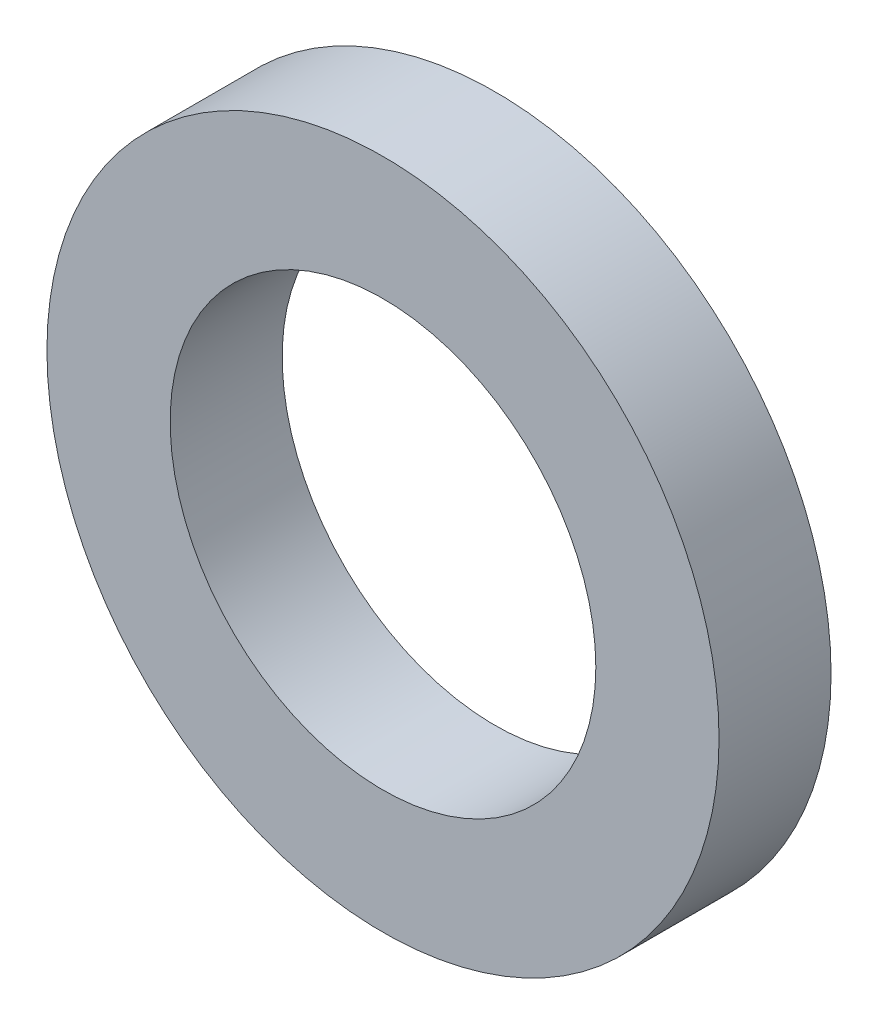
ISO-10303-21;
HEADER;
FILE_DESCRIPTION(('STEP AP214'),'2;1');
FILE_NAME('part.step','',(''),(''),'','','');
FILE_SCHEMA(('AUTOMOTIVE_DESIGN { 1 0 10303 214 1 1 1 1 }'));
ENDSEC;
DATA;
#1=APPLICATION_CONTEXT('core data for automotive mechanical design processes');
#2=APPLICATION_PROTOCOL_DEFINITION('international standard','automotive_design',2000,#1);
#3=PRODUCT_CONTEXT('',#1,'mechanical');
#4=PRODUCT('Part','Part','',(#3));
#5=PRODUCT_RELATED_PRODUCT_CATEGORY('part','',(#4));
#6=PRODUCT_DEFINITION_FORMATION('','',#4);
#7=PRODUCT_DEFINITION_CONTEXT('part definition',#1,'design');
#8=PRODUCT_DEFINITION('design','',#6,#7);
#9=PRODUCT_DEFINITION_SHAPE('','',#8);
#10=(LENGTH_UNIT() NAMED_UNIT(*) SI_UNIT(.MILLI.,.METRE.));
#11=(NAMED_UNIT(*) PLANE_ANGLE_UNIT() SI_UNIT($,.RADIAN.));
#12=(NAMED_UNIT(*) SI_UNIT($,.STERADIAN.) SOLID_ANGLE_UNIT());
#13=UNCERTAINTY_MEASURE_WITH_UNIT(LENGTH_MEASURE(1.E-05),#10,'distance_accuracy_value','');
#14=(GEOMETRIC_REPRESENTATION_CONTEXT(3) GLOBAL_UNCERTAINTY_ASSIGNED_CONTEXT((#13)) GLOBAL_UNIT_ASSIGNED_CONTEXT((#10,
#11,#12)) REPRESENTATION_CONTEXT('',''));
#15=CARTESIAN_POINT('',(0.,0.,0.));
#16=DIRECTION('',(0.,0.,1.));
#17=DIRECTION('',(1.,0.,0.));
#18=AXIS2_PLACEMENT_3D('',#15,#16,#17);
#19=CARTESIAN_POINT('',(0.,0.,1.));
#20=DIRECTION('',(0.,0.,1.));
#21=DIRECTION('',(1.,0.,0.));
#22=AXIS2_PLACEMENT_3D('',#19,#20,#21);
#23=PLANE('',#22);
#24=CARTESIAN_POINT('',(0.,0.,1.));
#25=DIRECTION('',(0.,0.,1.));
#26=DIRECTION('',(1.,0.,0.));
#27=AXIS2_PLACEMENT_3D('',#24,#25,#26);
#28=CIRCLE('',#27,3.);
#29=CARTESIAN_POINT('',(3.,0.,1.));
#30=VERTEX_POINT('',#29);
#31=EDGE_CURVE('E10',#30,#30,#28,.T.);
#32=ORIENTED_EDGE('',*,*,#31,.T.);
#33=EDGE_LOOP('',(#32));
#34=FACE_BOUND('',#33,.T.);
#35=CARTESIAN_POINT('',(0.,0.,1.));
#36=DIRECTION('',(0.,0.,1.));
#37=DIRECTION('',(1.,0.,0.));
#38=AXIS2_PLACEMENT_3D('',#35,#36,#37);
#39=CIRCLE('',#38,1.9);
#40=CARTESIAN_POINT('',(1.9,0.,1.));
#41=VERTEX_POINT('',#40);
#42=EDGE_CURVE('E50',#41,#41,#39,.T.);
#43=ORIENTED_EDGE('',*,*,#42,.F.);
#44=EDGE_LOOP('',(#43));
#45=FACE_BOUND('',#44,.T.);
#46=ADVANCED_FACE('F37',(#34,#45),#23,.T.);
#47=CARTESIAN_POINT('',(0.,0.,0.));
#48=DIRECTION('',(0.,0.,1.));
#49=DIRECTION('',(1.,0.,0.));
#50=AXIS2_PLACEMENT_3D('',#47,#48,#49);
#51=PLANE('',#50);
#52=CARTESIAN_POINT('',(0.,0.,0.));
#53=DIRECTION('',(0.,0.,1.));
#54=DIRECTION('',(1.,0.,0.));
#55=AXIS2_PLACEMENT_3D('',#52,#53,#54);
#56=CIRCLE('',#55,3.);
#57=CARTESIAN_POINT('',(3.,0.,0.));
#58=VERTEX_POINT('',#57);
#59=EDGE_CURVE('E41',#58,#58,#56,.T.);
#60=ORIENTED_EDGE('',*,*,#59,.F.);
#61=EDGE_LOOP('',(#60));
#62=FACE_BOUND('',#61,.T.);
#63=CARTESIAN_POINT('',(0.,0.,0.));
#64=DIRECTION('',(0.,0.,1.));
#65=DIRECTION('',(1.,0.,0.));
#66=AXIS2_PLACEMENT_3D('',#63,#64,#65);
#67=CIRCLE('',#66,1.9);
#68=CARTESIAN_POINT('',(1.9,0.,0.));
#69=VERTEX_POINT('',#68);
#70=EDGE_CURVE('E52',#69,#69,#67,.T.);
#71=ORIENTED_EDGE('',*,*,#70,.T.);
#72=EDGE_LOOP('',(#71));
#73=FACE_BOUND('',#72,.T.);
#74=ADVANCED_FACE('F64',(#62,#73),#51,.F.);
#75=CARTESIAN_POINT('',(0.,0.,1.));
#76=DIRECTION('',(0.,0.,-1.));
#77=DIRECTION('',(-1.,0.,0.));
#78=AXIS2_PLACEMENT_3D('',#75,#76,#77);
#79=CYLINDRICAL_SURFACE('',#78,3.);
#80=ORIENTED_EDGE('',*,*,#31,.F.);
#81=EDGE_LOOP('',(#80));
#82=FACE_BOUND('',#81,.T.);
#83=ORIENTED_EDGE('',*,*,#59,.T.);
#84=EDGE_LOOP('',(#83));
#85=FACE_BOUND('',#84,.T.);
#86=ADVANCED_FACE('F39',(#82,#85),#79,.T.);
#87=CARTESIAN_POINT('',(0.,0.,1.));
#88=DIRECTION('',(0.,0.,-1.));
#89=DIRECTION('',(-1.,0.,0.));
#90=AXIS2_PLACEMENT_3D('',#87,#88,#89);
#91=CYLINDRICAL_SURFACE('',#90,1.9);
#92=ORIENTED_EDGE('',*,*,#42,.T.);
#93=EDGE_LOOP('',(#92));
#94=FACE_BOUND('',#93,.T.);
#95=ORIENTED_EDGE('',*,*,#70,.F.);
#96=EDGE_LOOP('',(#95));
#97=FACE_BOUND('',#96,.T.);
#98=ADVANCED_FACE('F60',(#94,#97),#91,.F.);
#99=CLOSED_SHELL('',(#46,#74,#86,#98));
#100=MANIFOLD_SOLID_BREP('B2',#99);
#101=ADVANCED_BREP_SHAPE_REPRESENTATION('',(#18,#100),#14);
#102=SHAPE_DEFINITION_REPRESENTATION(#9,#101);
ENDSEC;
END-ISO-10303-21;
